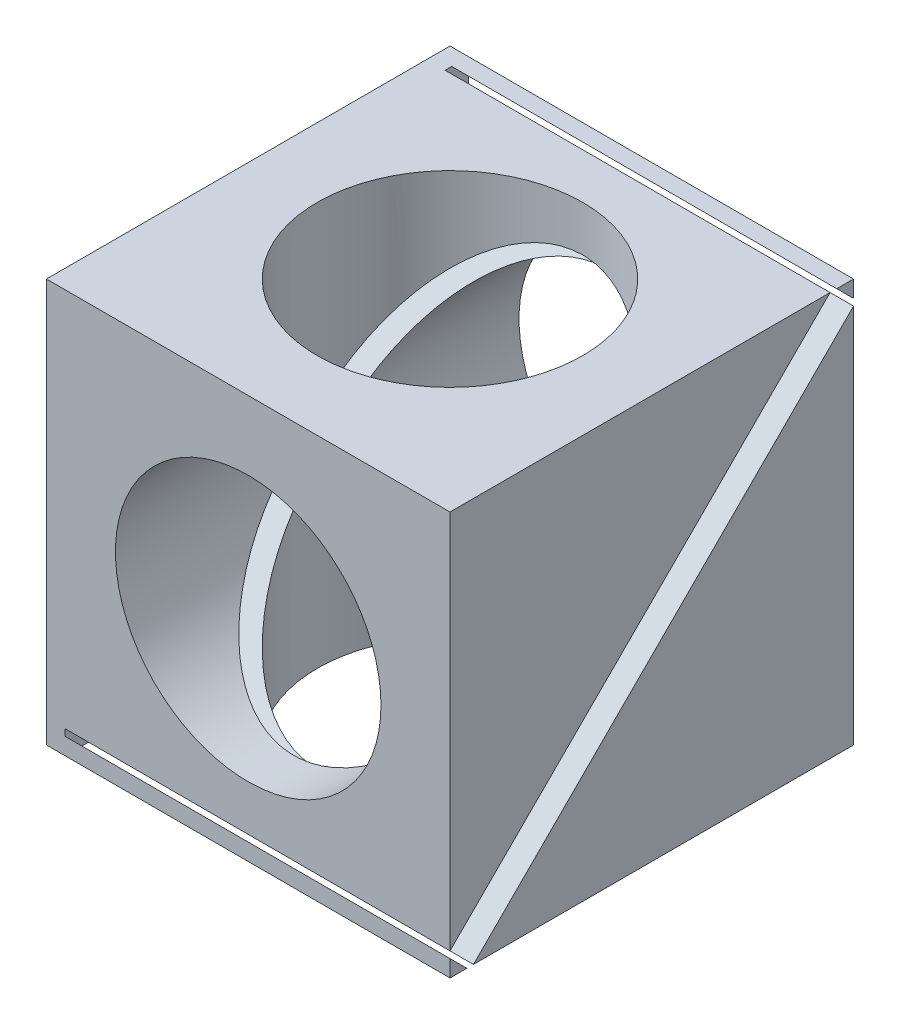
ISO-10303-21;
HEADER;
FILE_DESCRIPTION(('STEP AP214'),'2;1');
FILE_NAME('part.step','',(''),(''),'','','');
FILE_SCHEMA(('AUTOMOTIVE_DESIGN { 1 0 10303 214 1 1 1 1 }'));
ENDSEC;
DATA;
#1=APPLICATION_CONTEXT('core data for automotive mechanical design processes');
#2=APPLICATION_PROTOCOL_DEFINITION('international standard','automotive_design',2000,#1);
#3=PRODUCT_CONTEXT('',#1,'mechanical');
#4=PRODUCT('Part','Part','',(#3));
#5=PRODUCT_RELATED_PRODUCT_CATEGORY('part','',(#4));
#6=PRODUCT_DEFINITION_FORMATION('','',#4);
#7=PRODUCT_DEFINITION_CONTEXT('part definition',#1,'design');
#8=PRODUCT_DEFINITION('design','',#6,#7);
#9=PRODUCT_DEFINITION_SHAPE('','',#8);
#10=(LENGTH_UNIT() NAMED_UNIT(*) SI_UNIT(.MILLI.,.METRE.));
#11=(NAMED_UNIT(*) PLANE_ANGLE_UNIT() SI_UNIT($,.RADIAN.));
#12=(NAMED_UNIT(*) SI_UNIT($,.STERADIAN.) SOLID_ANGLE_UNIT());
#13=UNCERTAINTY_MEASURE_WITH_UNIT(LENGTH_MEASURE(1.E-05),#10,'distance_accuracy_value','');
#14=(GEOMETRIC_REPRESENTATION_CONTEXT(3) GLOBAL_UNCERTAINTY_ASSIGNED_CONTEXT((#13)) GLOBAL_UNIT_ASSIGNED_CONTEXT((#10,
#11,#12)) REPRESENTATION_CONTEXT('',''));
#15=CARTESIAN_POINT('',(0.,0.,0.));
#16=DIRECTION('',(0.,0.,1.));
#17=DIRECTION('',(1.,0.,0.));
#18=AXIS2_PLACEMENT_3D('',#15,#16,#17);
#19=CARTESIAN_POINT('',(19.304,19.304,19.304));
#20=DIRECTION('',(-1.,0.,0.));
#21=DIRECTION('',(0.,0.,1.));
#22=AXIS2_PLACEMENT_3D('',#19,#20,#21);
#23=PLANE('',#22);
#24=DIRECTION('',(0.,0.707106781186547,0.707106781186548));
#25=VECTOR('',#24,1.);
#26=CARTESIAN_POINT('',(19.304,17.3767955942687,-19.621859624536));
#27=LINE('',#26,#25);
#28=CARTESIAN_POINT('',(19.304,17.6946552188048,-19.304));
#29=VERTEX_POINT('',#28);
#30=CARTESIAN_POINT('',(19.304,19.304,-17.6946552188048));
#31=VERTEX_POINT('',#30);
#32=EDGE_CURVE('E270',#29,#31,#27,.T.);
#33=ORIENTED_EDGE('',*,*,#32,.F.);
#34=DIRECTION('',(0.,-1.,0.));
#35=VECTOR('',#34,1.);
#36=CARTESIAN_POINT('',(19.304,19.304,-19.304));
#37=LINE('',#36,#35);
#38=CARTESIAN_POINT('',(19.304,19.304,-19.304));
#39=VERTEX_POINT('',#38);
#40=EDGE_CURVE('E188',#39,#29,#37,.T.);
#41=ORIENTED_EDGE('',*,*,#40,.F.);
#42=DIRECTION('',(0.,0.,-1.));
#43=VECTOR('',#42,1.);
#44=CARTESIAN_POINT('',(19.304,19.304,19.304));
#45=LINE('',#44,#43);
#46=EDGE_CURVE('E177',#31,#39,#45,.T.);
#47=ORIENTED_EDGE('',*,*,#46,.F.);
#48=EDGE_LOOP('',(#33,#41,#47));
#49=FACE_BOUND('',#48,.T.);
#50=ADVANCED_FACE('F33',(#49),#23,.F.);
#51=DIRECTION('',(0.,-0.707106781186547,0.707106781186548));
#52=VECTOR('',#51,1.);
#53=CARTESIAN_POINT('',(19.304,-17.3767955942689,19.6218596245362));
#54=LINE('',#53,#52);
#55=CARTESIAN_POINT('',(19.304,19.304,-17.0589359697327));
#56=VERTEX_POINT('',#55);
#57=CARTESIAN_POINT('',(19.304,-17.0589359697327,19.304));
#58=VERTEX_POINT('',#57);
#59=EDGE_CURVE('E218',#56,#58,#54,.T.);
#60=ORIENTED_EDGE('',*,*,#59,.F.);
#61=CARTESIAN_POINT('',(19.304,19.304,19.304));
#62=VERTEX_POINT('',#61);
#63=EDGE_CURVE('E257',#62,#56,#45,.T.);
#64=ORIENTED_EDGE('',*,*,#63,.F.);
#65=DIRECTION('',(0.,-1.,0.));
#66=VECTOR('',#65,1.);
#67=CARTESIAN_POINT('',(19.304,19.304,19.304));
#68=LINE('',#67,#66);
#69=EDGE_CURVE('E178',#62,#58,#68,.T.);
#70=ORIENTED_EDGE('',*,*,#69,.T.);
#71=EDGE_LOOP('',(#60,#64,#70));
#72=FACE_BOUND('',#71,.T.);
#73=ADVANCED_FACE('F268',(#72),#23,.F.);
#74=DIRECTION('',(0.,-0.707106781186547,-0.707106781186547));
#75=VECTOR('',#74,1.);
#76=CARTESIAN_POINT('',(19.304,-19.6218596245362,17.3767955942689));
#77=LINE('',#76,#75);
#78=CARTESIAN_POINT('',(19.304,-17.6946552188051,19.304));
#79=VERTEX_POINT('',#78);
#80=CARTESIAN_POINT('',(19.304,-19.304,17.6946552188051));
#81=VERTEX_POINT('',#80);
#82=EDGE_CURVE('E155',#79,#81,#77,.T.);
#83=ORIENTED_EDGE('',*,*,#82,.F.);
#84=CARTESIAN_POINT('',(19.304,-19.304,19.304));
#85=VERTEX_POINT('',#84);
#86=EDGE_CURVE('E182',#79,#85,#68,.T.);
#87=ORIENTED_EDGE('',*,*,#86,.T.);
#88=DIRECTION('',(0.,0.,-1.));
#89=VECTOR('',#88,1.);
#90=CARTESIAN_POINT('',(19.304,-19.304,19.304));
#91=LINE('',#90,#89);
#92=EDGE_CURVE('E160',#85,#81,#91,.T.);
#93=ORIENTED_EDGE('',*,*,#92,.T.);
#94=EDGE_LOOP('',(#83,#87,#93));
#95=FACE_BOUND('',#94,.T.);
#96=ADVANCED_FACE('F220',(#95),#23,.F.);
#97=DIRECTION('',(0.,0.707106781186548,-0.707106781186547));
#98=VECTOR('',#97,1.);
#99=CARTESIAN_POINT('',(19.304,-19.6218596245362,17.3767955942689));
#100=LINE('',#99,#98);
#101=CARTESIAN_POINT('',(19.304,-19.304,17.0589359697327));
#102=VERTEX_POINT('',#101);
#103=CARTESIAN_POINT('',(19.304,17.0589359697327,-19.304));
#104=VERTEX_POINT('',#103);
#105=EDGE_CURVE('E138',#102,#104,#100,.T.);
#106=ORIENTED_EDGE('',*,*,#105,.F.);
#107=CARTESIAN_POINT('',(19.304,-19.304,-19.304));
#108=VERTEX_POINT('',#107);
#109=EDGE_CURVE('E151',#102,#108,#91,.T.);
#110=ORIENTED_EDGE('',*,*,#109,.T.);
#111=EDGE_CURVE('E153',#104,#108,#37,.T.);
#112=ORIENTED_EDGE('',*,*,#111,.F.);
#113=EDGE_LOOP('',(#106,#110,#112));
#114=FACE_BOUND('',#113,.T.);
#115=ADVANCED_FACE('F150',(#114),#23,.F.);
#116=CARTESIAN_POINT('',(-19.304,19.304,-19.304));
#117=DIRECTION('',(0.,0.,1.));
#118=DIRECTION('',(1.,0.,0.));
#119=AXIS2_PLACEMENT_3D('',#116,#117,#118);
#120=PLANE('',#119);
#121=CARTESIAN_POINT('',(0.,0.,-19.304));
#122=DIRECTION('',(0.,0.,1.));
#123=DIRECTION('',(1.,0.,0.));
#124=AXIS2_PLACEMENT_3D('',#121,#122,#123);
#125=CIRCLE('',#124,12.7);
#126=CARTESIAN_POINT('',(12.7,0.,-19.304));
#127=VERTEX_POINT('',#126);
#128=EDGE_CURVE('E161',#127,#127,#125,.T.);
#129=ORIENTED_EDGE('',*,*,#128,.T.);
#130=EDGE_LOOP('',(#129));
#131=FACE_BOUND('',#130,.T.);
#132=ORIENTED_EDGE('',*,*,#40,.T.);
#133=DIRECTION('',(-1.,0.,0.));
#134=VECTOR('',#133,1.);
#135=CARTESIAN_POINT('',(-19.304,17.6946552188048,-19.304));
#136=LINE('',#135,#134);
#137=CARTESIAN_POINT('',(-17.526,17.6946552188048,-19.304));
#138=VERTEX_POINT('',#137);
#139=EDGE_CURVE('E247',#29,#138,#136,.T.);
#140=ORIENTED_EDGE('',*,*,#139,.T.);
#141=DIRECTION('',(0.,-1.,0.));
#142=VECTOR('',#141,1.);
#143=CARTESIAN_POINT('',(-17.526,19.304,-19.304));
#144=LINE('',#143,#142);
#145=CARTESIAN_POINT('',(-17.526,17.0589359697327,-19.304));
#146=VERTEX_POINT('',#145);
#147=EDGE_CURVE('E235',#138,#146,#144,.T.);
#148=ORIENTED_EDGE('',*,*,#147,.T.);
#149=DIRECTION('',(1.,0.,0.));
#150=VECTOR('',#149,1.);
#151=CARTESIAN_POINT('',(-19.304,17.0589359697327,-19.304));
#152=LINE('',#151,#150);
#153=EDGE_CURVE('E145',#146,#104,#152,.T.);
#154=ORIENTED_EDGE('',*,*,#153,.T.);
#155=ORIENTED_EDGE('',*,*,#111,.T.);
#156=DIRECTION('',(-1.,0.,0.));
#157=VECTOR('',#156,1.);
#158=CARTESIAN_POINT('',(-19.304,-19.304,-19.304));
#159=LINE('',#158,#157);
#160=CARTESIAN_POINT('',(-19.304,-19.304,-19.304));
#161=VERTEX_POINT('',#160);
#162=EDGE_CURVE('E159',#108,#161,#159,.T.);
#163=ORIENTED_EDGE('',*,*,#162,.T.);
#164=DIRECTION('',(0.,-1.,0.));
#165=VECTOR('',#164,1.);
#166=CARTESIAN_POINT('',(-19.304,19.304,-19.304));
#167=LINE('',#166,#165);
#168=CARTESIAN_POINT('',(-19.304,19.304,-19.304));
#169=VERTEX_POINT('',#168);
#170=EDGE_CURVE('E185',#169,#161,#167,.T.);
#171=ORIENTED_EDGE('',*,*,#170,.F.);
#172=DIRECTION('',(-1.,0.,0.));
#173=VECTOR('',#172,1.);
#174=CARTESIAN_POINT('',(-19.304,19.304,-19.304));
#175=LINE('',#174,#173);
#176=EDGE_CURVE('E233',#39,#169,#175,.T.);
#177=ORIENTED_EDGE('',*,*,#176,.F.);
#178=EDGE_LOOP('',(#132,#140,#148,#154,#155,#163,#171,#177));
#179=FACE_BOUND('',#178,.T.);
#180=ADVANCED_FACE('F232',(#131,#179),#120,.F.);
#181=CARTESIAN_POINT('',(-19.304,19.304,19.304));
#182=DIRECTION('',(0.,0.,-1.));
#183=DIRECTION('',(-1.,0.,0.));
#184=AXIS2_PLACEMENT_3D('',#181,#182,#183);
#185=PLANE('',#184);
#186=CARTESIAN_POINT('',(0.,0.,19.304));
#187=DIRECTION('',(0.,0.,1.));
#188=DIRECTION('',(1.,0.,0.));
#189=AXIS2_PLACEMENT_3D('',#186,#187,#188);
#190=CIRCLE('',#189,12.7);
#191=CARTESIAN_POINT('',(12.7,0.,19.304));
#192=VERTEX_POINT('',#191);
#193=EDGE_CURVE('E165',#192,#192,#190,.T.);
#194=ORIENTED_EDGE('',*,*,#193,.F.);
#195=EDGE_LOOP('',(#194));
#196=FACE_BOUND('',#195,.T.);
#197=DIRECTION('',(1.,0.,0.));
#198=VECTOR('',#197,1.);
#199=CARTESIAN_POINT('',(-19.304,-17.0589359697327,19.304));
#200=LINE('',#199,#198);
#201=CARTESIAN_POINT('',(-17.526,-17.0589359697327,19.304));
#202=VERTEX_POINT('',#201);
#203=EDGE_CURVE('E264',#202,#58,#200,.T.);
#204=ORIENTED_EDGE('',*,*,#203,.T.);
#205=ORIENTED_EDGE('',*,*,#69,.F.);
#206=DIRECTION('',(1.,0.,0.));
#207=VECTOR('',#206,1.);
#208=CARTESIAN_POINT('',(-19.304,19.304,19.304));
#209=LINE('',#208,#207);
#210=CARTESIAN_POINT('',(-19.304,19.304,19.304));
#211=VERTEX_POINT('',#210);
#212=EDGE_CURVE('E169',#211,#62,#209,.T.);
#213=ORIENTED_EDGE('',*,*,#212,.F.);
#214=DIRECTION('',(0.,-1.,0.));
#215=VECTOR('',#214,1.);
#216=CARTESIAN_POINT('',(-19.304,19.304,19.304));
#217=LINE('',#216,#215);
#218=CARTESIAN_POINT('',(-19.304,-19.304,19.304));
#219=VERTEX_POINT('',#218);
#220=EDGE_CURVE('E181',#211,#219,#217,.T.);
#221=ORIENTED_EDGE('',*,*,#220,.T.);
#222=DIRECTION('',(1.,0.,0.));
#223=VECTOR('',#222,1.);
#224=CARTESIAN_POINT('',(-19.304,-19.304,19.304));
#225=LINE('',#224,#223);
#226=EDGE_CURVE('E174',#219,#85,#225,.T.);
#227=ORIENTED_EDGE('',*,*,#226,.T.);
#228=ORIENTED_EDGE('',*,*,#86,.F.);
#229=DIRECTION('',(-1.,0.,0.));
#230=VECTOR('',#229,1.);
#231=CARTESIAN_POINT('',(-19.304,-17.6946552188051,19.304));
#232=LINE('',#231,#230);
#233=CARTESIAN_POINT('',(-17.526,-17.6946552188051,19.304));
#234=VERTEX_POINT('',#233);
#235=EDGE_CURVE('E215',#79,#234,#232,.T.);
#236=ORIENTED_EDGE('',*,*,#235,.T.);
#237=DIRECTION('',(0.,1.,0.));
#238=VECTOR('',#237,1.);
#239=CARTESIAN_POINT('',(-17.526,19.304,19.304));
#240=LINE('',#239,#238);
#241=EDGE_CURVE('E239',#234,#202,#240,.T.);
#242=ORIENTED_EDGE('',*,*,#241,.T.);
#243=EDGE_LOOP('',(#204,#205,#213,#221,#227,#228,#236,#242));
#244=FACE_BOUND('',#243,.T.);
#245=ADVANCED_FACE('F222',(#196,#244),#185,.F.);
#246=CARTESIAN_POINT('',(0.,19.304,0.));
#247=DIRECTION('',(0.,-1.,0.));
#248=DIRECTION('',(0.,0.,-1.));
#249=AXIS2_PLACEMENT_3D('',#246,#247,#248);
#250=PLANE('',#249);
#251=CARTESIAN_POINT('',(0.,19.304,0.));
#252=DIRECTION('',(0.,-1.,0.));
#253=DIRECTION('',(0.,0.,-1.));
#254=AXIS2_PLACEMENT_3D('',#251,#252,#253);
#255=CIRCLE('',#254,12.7);
#256=CARTESIAN_POINT('',(0.,19.304,-12.7));
#257=VERTEX_POINT('',#256);
#258=EDGE_CURVE('E252',#257,#257,#255,.T.);
#259=ORIENTED_EDGE('',*,*,#258,.T.);
#260=EDGE_LOOP('',(#259));
#261=FACE_BOUND('',#260,.T.);
#262=DIRECTION('',(1.,0.,0.));
#263=VECTOR('',#262,1.);
#264=CARTESIAN_POINT('',(0.,19.304,-17.6946552188048));
#265=LINE('',#264,#263);
#266=CARTESIAN_POINT('',(-17.526,19.304,-17.6946552188048));
#267=VERTEX_POINT('',#266);
#268=EDGE_CURVE('E11',#267,#31,#265,.T.);
#269=ORIENTED_EDGE('',*,*,#268,.T.);
#270=ORIENTED_EDGE('',*,*,#46,.T.);
#271=ORIENTED_EDGE('',*,*,#176,.T.);
#272=DIRECTION('',(0.,0.,1.));
#273=VECTOR('',#272,1.);
#274=CARTESIAN_POINT('',(-19.304,19.304,19.304));
#275=LINE('',#274,#273);
#276=EDGE_CURVE('E229',#169,#211,#275,.T.);
#277=ORIENTED_EDGE('',*,*,#276,.T.);
#278=ORIENTED_EDGE('',*,*,#212,.T.);
#279=ORIENTED_EDGE('',*,*,#63,.T.);
#280=DIRECTION('',(-1.,0.,0.));
#281=VECTOR('',#280,1.);
#282=CARTESIAN_POINT('',(0.,19.304,-17.0589359697327));
#283=LINE('',#282,#281);
#284=CARTESIAN_POINT('',(-17.526,19.304,-17.0589359697327));
#285=VERTEX_POINT('',#284);
#286=EDGE_CURVE('E283',#56,#285,#283,.T.);
#287=ORIENTED_EDGE('',*,*,#286,.T.);
#288=DIRECTION('',(0.,0.,-1.));
#289=VECTOR('',#288,1.);
#290=CARTESIAN_POINT('',(-17.526,19.304,0.));
#291=LINE('',#290,#289);
#292=EDGE_CURVE('E236',#285,#267,#291,.T.);
#293=ORIENTED_EDGE('',*,*,#292,.T.);
#294=EDGE_LOOP('',(#269,#270,#271,#277,#278,#279,#287,#293));
#295=FACE_BOUND('',#294,.T.);
#296=ADVANCED_FACE('F262',(#261,#295),#250,.F.);
#297=CARTESIAN_POINT('',(0.,-19.304,0.));
#298=DIRECTION('',(0.,-1.,0.));
#299=DIRECTION('',(0.,0.,-1.));
#300=AXIS2_PLACEMENT_3D('',#297,#298,#299);
#301=PLANE('',#300);
#302=CARTESIAN_POINT('',(0.,-19.304,0.));
#303=DIRECTION('',(0.,-1.,0.));
#304=DIRECTION('',(0.,0.,-1.));
#305=AXIS2_PLACEMENT_3D('',#302,#303,#304);
#306=CIRCLE('',#305,12.7);
#307=CARTESIAN_POINT('',(0.,-19.304,-12.7));
#308=VERTEX_POINT('',#307);
#309=EDGE_CURVE('E249',#308,#308,#306,.T.);
#310=ORIENTED_EDGE('',*,*,#309,.F.);
#311=EDGE_LOOP('',(#310));
#312=FACE_BOUND('',#311,.T.);
#313=DIRECTION('',(-1.,0.,0.));
#314=VECTOR('',#313,1.);
#315=CARTESIAN_POINT('',(0.,-19.304,17.6946552188051));
#316=LINE('',#315,#314);
#317=CARTESIAN_POINT('',(-17.526,-19.304,17.6946552188051));
#318=VERTEX_POINT('',#317);
#319=EDGE_CURVE('E199',#81,#318,#316,.T.);
#320=ORIENTED_EDGE('',*,*,#319,.F.);
#321=ORIENTED_EDGE('',*,*,#92,.F.);
#322=ORIENTED_EDGE('',*,*,#226,.F.);
#323=DIRECTION('',(0.,0.,1.));
#324=VECTOR('',#323,1.);
#325=CARTESIAN_POINT('',(-19.304,-19.304,19.304));
#326=LINE('',#325,#324);
#327=EDGE_CURVE('E172',#161,#219,#326,.T.);
#328=ORIENTED_EDGE('',*,*,#327,.F.);
#329=ORIENTED_EDGE('',*,*,#162,.F.);
#330=ORIENTED_EDGE('',*,*,#109,.F.);
#331=DIRECTION('',(1.,0.,0.));
#332=VECTOR('',#331,1.);
#333=CARTESIAN_POINT('',(0.,-19.304,17.0589359697327));
#334=LINE('',#333,#332);
#335=CARTESIAN_POINT('',(-17.526,-19.304,17.0589359697327));
#336=VERTEX_POINT('',#335);
#337=EDGE_CURVE('E135',#336,#102,#334,.T.);
#338=ORIENTED_EDGE('',*,*,#337,.F.);
#339=DIRECTION('',(0.,0.,-1.));
#340=VECTOR('',#339,1.);
#341=CARTESIAN_POINT('',(-17.526,-19.304,0.));
#342=LINE('',#341,#340);
#343=EDGE_CURVE('E40',#318,#336,#342,.T.);
#344=ORIENTED_EDGE('',*,*,#343,.F.);
#345=EDGE_LOOP('',(#320,#321,#322,#328,#329,#330,#338,#344));
#346=FACE_BOUND('',#345,.T.);
#347=ADVANCED_FACE('F157',(#312,#346),#301,.T.);
#348=CARTESIAN_POINT('',(0.,0.,-19.304));
#349=DIRECTION('',(0.,0.,1.));
#350=DIRECTION('',(1.,0.,0.));
#351=AXIS2_PLACEMENT_3D('',#348,#349,#350);
#352=CYLINDRICAL_SURFACE('',#351,12.7);
#353=ORIENTED_EDGE('',*,*,#193,.T.);
#354=EDGE_LOOP('',(#353));
#355=FACE_BOUND('',#354,.T.);
#356=CARTESIAN_POINT('',(0.,0.,0.));
#357=DIRECTION('',(0.,-0.707106781186547,0.707106781186548));
#358=DIRECTION('',(0.,0.707106781186547,0.707106781186548));
#359=AXIS2_PLACEMENT_3D('',#356,#357,#358);
#360=ELLIPSE('',#359,17.9605122421383,12.7);
#361=CARTESIAN_POINT('',(-12.6502933513417,1.12253201513365,1.12253201513365));
#362=VERTEX_POINT('',#361);
#363=CARTESIAN_POINT('',(12.6502933513417,1.12253201513365,1.12253201513365));
#364=VERTEX_POINT('',#363);
#365=EDGE_CURVE('E194',#362,#364,#360,.F.);
#366=ORIENTED_EDGE('',*,*,#365,.T.);
#367=CARTESIAN_POINT('',(0.,0.,2.2450640302673));
#368=DIRECTION('',(0.,0.707106781186548,0.707106781186547));
#369=DIRECTION('',(0.,-0.707106781186547,0.707106781186548));
#370=AXIS2_PLACEMENT_3D('',#367,#368,#369);
#371=ELLIPSE('',#370,17.9605122421383,12.7);
#372=EDGE_CURVE('E281',#364,#362,#371,.F.);
#373=ORIENTED_EDGE('',*,*,#372,.T.);
#374=EDGE_LOOP('',(#366,#373));
#375=FACE_BOUND('',#374,.T.);
#376=ADVANCED_FACE('F300',(#355,#375),#352,.F.);
#377=CARTESIAN_POINT('',(-19.304,19.304,19.304));
#378=DIRECTION('',(1.,0.,0.));
#379=DIRECTION('',(0.,0.,-1.));
#380=AXIS2_PLACEMENT_3D('',#377,#378,#379);
#381=PLANE('',#380);
#382=ORIENTED_EDGE('',*,*,#327,.T.);
#383=ORIENTED_EDGE('',*,*,#220,.F.);
#384=ORIENTED_EDGE('',*,*,#276,.F.);
#385=ORIENTED_EDGE('',*,*,#170,.T.);
#386=EDGE_LOOP('',(#382,#383,#384,#385));
#387=FACE_BOUND('',#386,.T.);
#388=ADVANCED_FACE('F226',(#387),#381,.F.);
#389=CARTESIAN_POINT('',(0.,0.,0.));
#390=DIRECTION('',(0.,-0.707106781186547,0.707106781186548));
#391=DIRECTION('',(0.,0.707106781186547,0.707106781186548));
#392=AXIS2_PLACEMENT_3D('',#389,#390,#391);
#393=ELLIPSE('',#392,17.9605122421383,12.7);
#394=CARTESIAN_POINT('',(-12.6502933513417,-1.12253201513365,-1.12253201513365));
#395=VERTEX_POINT('',#394);
#396=CARTESIAN_POINT('',(12.6502933513417,-1.12253201513365,-1.12253201513365));
#397=VERTEX_POINT('',#396);
#398=EDGE_CURVE('E191',#395,#397,#393,.T.);
#399=ORIENTED_EDGE('',*,*,#398,.T.);
#400=CARTESIAN_POINT('',(0.,0.,-2.2450640302673));
#401=DIRECTION('',(0.,-0.707106781186547,-0.707106781186548));
#402=DIRECTION('',(0.,-0.707106781186548,0.707106781186547));
#403=AXIS2_PLACEMENT_3D('',#400,#401,#402);
#404=ELLIPSE('',#403,17.9605122421383,12.7);
#405=EDGE_CURVE('E146',#397,#395,#404,.F.);
#406=ORIENTED_EDGE('',*,*,#405,.T.);
#407=EDGE_LOOP('',(#399,#406));
#408=FACE_BOUND('',#407,.T.);
#409=ORIENTED_EDGE('',*,*,#128,.F.);
#410=EDGE_LOOP('',(#409));
#411=FACE_BOUND('',#410,.T.);
#412=ADVANCED_FACE('F286',(#408,#411),#352,.F.);
#413=CARTESIAN_POINT('',(0.,19.304012,0.));
#414=DIRECTION('',(0.,-1.,0.));
#415=DIRECTION('',(0.,0.,-1.));
#416=AXIS2_PLACEMENT_3D('',#413,#414,#415);
#417=CYLINDRICAL_SURFACE('',#416,12.7);
#418=ORIENTED_EDGE('',*,*,#309,.T.);
#419=EDGE_LOOP('',(#418));
#420=FACE_BOUND('',#419,.T.);
#421=ORIENTED_EDGE('',*,*,#398,.F.);
#422=CARTESIAN_POINT('',(0.,-2.2450640302673,0.));
#423=DIRECTION('',(0.,-0.707106781186547,-0.707106781186548));
#424=DIRECTION('',(0.,-0.707106781186548,0.707106781186547));
#425=AXIS2_PLACEMENT_3D('',#422,#423,#424);
#426=ELLIPSE('',#425,17.9605122421383,12.7);
#427=EDGE_CURVE('E46',#395,#397,#426,.F.);
#428=ORIENTED_EDGE('',*,*,#427,.T.);
#429=EDGE_LOOP('',(#421,#428));
#430=FACE_BOUND('',#429,.T.);
#431=ADVANCED_FACE('F289',(#420,#430),#417,.F.);
#432=ORIENTED_EDGE('',*,*,#365,.F.);
#433=CARTESIAN_POINT('',(0.,2.2450640302673,0.));
#434=DIRECTION('',(0.,0.707106781186548,0.707106781186547));
#435=DIRECTION('',(0.,-0.707106781186547,0.707106781186548));
#436=AXIS2_PLACEMENT_3D('',#433,#434,#435);
#437=ELLIPSE('',#436,17.9605122421383,12.7);
#438=EDGE_CURVE('E53',#362,#364,#437,.F.);
#439=ORIENTED_EDGE('',*,*,#438,.T.);
#440=EDGE_LOOP('',(#432,#439));
#441=FACE_BOUND('',#440,.T.);
#442=ORIENTED_EDGE('',*,*,#258,.F.);
#443=EDGE_LOOP('',(#442));
#444=FACE_BOUND('',#443,.T.);
#445=ADVANCED_FACE('F291',(#441,#444),#417,.F.);
#446=CARTESIAN_POINT('',(-17.526,17.3767955942687,-19.621859624536));
#447=DIRECTION('',(0.,0.707106781186548,-0.707106781186547));
#448=DIRECTION('',(0.,0.707106781186547,0.707106781186548));
#449=AXIS2_PLACEMENT_3D('',#446,#447,#448);
#450=PLANE('',#449);
#451=DIRECTION('',(0.,0.707106781186547,0.707106781186548));
#452=VECTOR('',#451,1.);
#453=CARTESIAN_POINT('',(-17.526,17.3767955942687,-19.621859624536));
#454=LINE('',#453,#452);
#455=EDGE_CURVE('E154',#138,#267,#454,.T.);
#456=ORIENTED_EDGE('',*,*,#455,.F.);
#457=ORIENTED_EDGE('',*,*,#139,.F.);
#458=ORIENTED_EDGE('',*,*,#32,.T.);
#459=ORIENTED_EDGE('',*,*,#268,.F.);
#460=EDGE_LOOP('',(#456,#457,#458,#459));
#461=FACE_BOUND('',#460,.T.);
#462=ADVANCED_FACE('F298',(#461),#450,.F.);
#463=CARTESIAN_POINT('',(-17.526,-19.6218596245362,17.3767955942689));
#464=DIRECTION('',(0.,-0.707106781186548,0.707106781186548));
#465=DIRECTION('',(0.,-0.707106781186548,-0.707106781186548));
#466=AXIS2_PLACEMENT_3D('',#463,#464,#465);
#467=PLANE('',#466);
#468=DIRECTION('',(0.,-0.707106781186547,-0.707106781186547));
#469=VECTOR('',#468,1.);
#470=CARTESIAN_POINT('',(-17.526,-19.6218596245362,17.3767955942689));
#471=LINE('',#470,#469);
#472=EDGE_CURVE('E208',#234,#318,#471,.T.);
#473=ORIENTED_EDGE('',*,*,#472,.F.);
#474=ORIENTED_EDGE('',*,*,#235,.F.);
#475=ORIENTED_EDGE('',*,*,#82,.T.);
#476=ORIENTED_EDGE('',*,*,#319,.T.);
#477=EDGE_LOOP('',(#473,#474,#475,#476));
#478=FACE_BOUND('',#477,.T.);
#479=ADVANCED_FACE('F214',(#478),#467,.F.);
#480=CARTESIAN_POINT('',(-17.526,0.,0.));
#481=DIRECTION('',(-1.,0.,0.));
#482=DIRECTION('',(0.,0.,1.));
#483=AXIS2_PLACEMENT_3D('',#480,#481,#482);
#484=PLANE('',#483);
#485=ORIENTED_EDGE('',*,*,#455,.T.);
#486=ORIENTED_EDGE('',*,*,#292,.F.);
#487=DIRECTION('',(0.,-0.707106781186547,0.707106781186548));
#488=VECTOR('',#487,1.);
#489=CARTESIAN_POINT('',(-17.526,-17.3767955942689,19.6218596245362));
#490=LINE('',#489,#488);
#491=EDGE_CURVE('E276',#285,#202,#490,.T.);
#492=ORIENTED_EDGE('',*,*,#491,.T.);
#493=ORIENTED_EDGE('',*,*,#241,.F.);
#494=ORIENTED_EDGE('',*,*,#472,.T.);
#495=ORIENTED_EDGE('',*,*,#343,.T.);
#496=DIRECTION('',(0.,0.707106781186548,-0.707106781186547));
#497=VECTOR('',#496,1.);
#498=CARTESIAN_POINT('',(-17.526,-19.6218596245362,17.3767955942689));
#499=LINE('',#498,#497);
#500=EDGE_CURVE('E141',#336,#146,#499,.T.);
#501=ORIENTED_EDGE('',*,*,#500,.T.);
#502=ORIENTED_EDGE('',*,*,#147,.F.);
#503=EDGE_LOOP('',(#485,#486,#492,#493,#494,#495,#501,#502));
#504=FACE_BOUND('',#503,.T.);
#505=ADVANCED_FACE('F203',(#504),#484,.F.);
#506=CARTESIAN_POINT('',(-17.526,-19.6218596245362,17.3767955942689));
#507=DIRECTION('',(0.,-0.707106781186547,-0.707106781186548));
#508=DIRECTION('',(0.,0.707106781186548,-0.707106781186547));
#509=AXIS2_PLACEMENT_3D('',#506,#507,#508);
#510=PLANE('',#509);
#511=ORIENTED_EDGE('',*,*,#405,.F.);
#512=ORIENTED_EDGE('',*,*,#427,.F.);
#513=EDGE_LOOP('',(#511,#512));
#514=FACE_BOUND('',#513,.T.);
#515=ORIENTED_EDGE('',*,*,#337,.T.);
#516=ORIENTED_EDGE('',*,*,#105,.T.);
#517=ORIENTED_EDGE('',*,*,#153,.F.);
#518=ORIENTED_EDGE('',*,*,#500,.F.);
#519=EDGE_LOOP('',(#515,#516,#517,#518));
#520=FACE_BOUND('',#519,.T.);
#521=ADVANCED_FACE('F137',(#514,#520),#510,.F.);
#522=CARTESIAN_POINT('',(-17.526,-17.3767955942689,19.6218596245362));
#523=DIRECTION('',(0.,0.707106781186548,0.707106781186547));
#524=DIRECTION('',(0.,-0.707106781186547,0.707106781186548));
#525=AXIS2_PLACEMENT_3D('',#522,#523,#524);
#526=PLANE('',#525);
#527=ORIENTED_EDGE('',*,*,#372,.F.);
#528=ORIENTED_EDGE('',*,*,#438,.F.);
#529=EDGE_LOOP('',(#527,#528));
#530=FACE_BOUND('',#529,.T.);
#531=ORIENTED_EDGE('',*,*,#491,.F.);
#532=ORIENTED_EDGE('',*,*,#286,.F.);
#533=ORIENTED_EDGE('',*,*,#59,.T.);
#534=ORIENTED_EDGE('',*,*,#203,.F.);
#535=EDGE_LOOP('',(#531,#532,#533,#534));
#536=FACE_BOUND('',#535,.T.);
#537=ADVANCED_FACE('F391',(#530,#536),#526,.F.);
#538=CLOSED_SHELL('',(#50,#73,#96,#115,#180,#245,#296,#347,#376,#388,#412,#431,#445,#462,#479,
#505,#521,#537));
#539=MANIFOLD_SOLID_BREP('B2',#538);
#540=ADVANCED_BREP_SHAPE_REPRESENTATION('',(#18,#539),#14);
#541=SHAPE_DEFINITION_REPRESENTATION(#9,#540);
ENDSEC;
END-ISO-10303-21;
